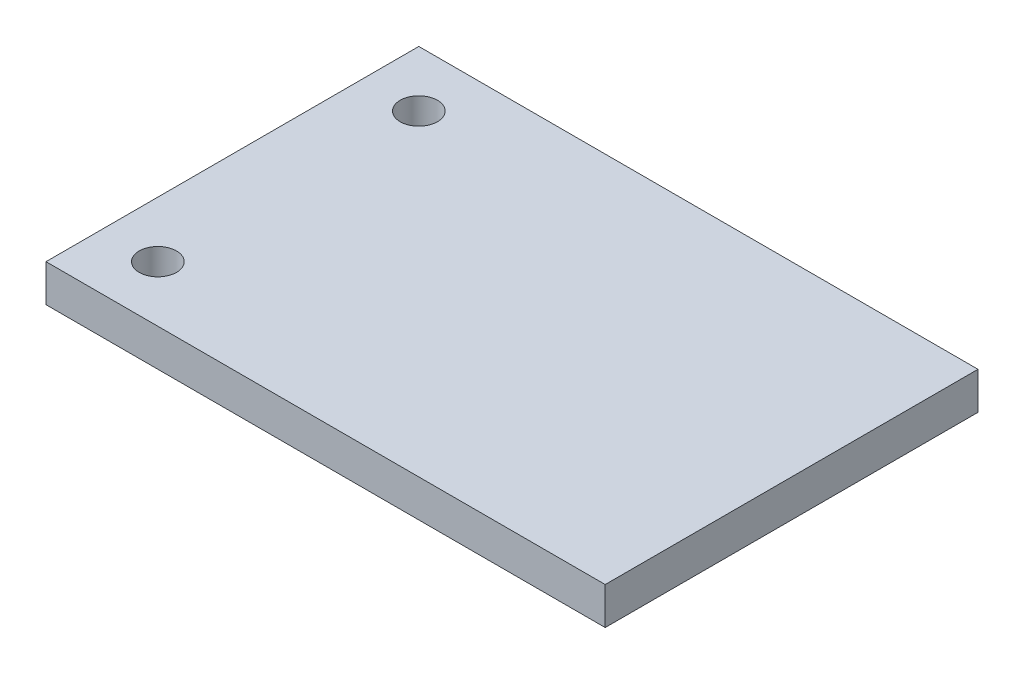
ISO-10303-21;
HEADER;
FILE_DESCRIPTION(('STEP AP214'),'2;1');
FILE_NAME('part.step','',(''),(''),'','','');
FILE_SCHEMA(('AUTOMOTIVE_DESIGN { 1 0 10303 214 1 1 1 1 }'));
ENDSEC;
DATA;
#1=APPLICATION_CONTEXT('core data for automotive mechanical design processes');
#2=APPLICATION_PROTOCOL_DEFINITION('international standard','automotive_design',2000,#1);
#3=PRODUCT_CONTEXT('',#1,'mechanical');
#4=PRODUCT('Part','Part','',(#3));
#5=PRODUCT_RELATED_PRODUCT_CATEGORY('part','',(#4));
#6=PRODUCT_DEFINITION_FORMATION('','',#4);
#7=PRODUCT_DEFINITION_CONTEXT('part definition',#1,'design');
#8=PRODUCT_DEFINITION('design','',#6,#7);
#9=PRODUCT_DEFINITION_SHAPE('','',#8);
#10=(LENGTH_UNIT() NAMED_UNIT(*) SI_UNIT(.MILLI.,.METRE.));
#11=(NAMED_UNIT(*) PLANE_ANGLE_UNIT() SI_UNIT($,.RADIAN.));
#12=(NAMED_UNIT(*) SI_UNIT($,.STERADIAN.) SOLID_ANGLE_UNIT());
#13=UNCERTAINTY_MEASURE_WITH_UNIT(LENGTH_MEASURE(1.E-05),#10,'distance_accuracy_value','');
#14=(GEOMETRIC_REPRESENTATION_CONTEXT(3) GLOBAL_UNCERTAINTY_ASSIGNED_CONTEXT((#13)) GLOBAL_UNIT_ASSIGNED_CONTEXT((#10,
#11,#12)) REPRESENTATION_CONTEXT('',''));
#15=CARTESIAN_POINT('',(0.,0.,0.));
#16=DIRECTION('',(0.,0.,1.));
#17=DIRECTION('',(1.,0.,0.));
#18=AXIS2_PLACEMENT_3D('',#15,#16,#17);
#19=CARTESIAN_POINT('',(0.,20.,0.));
#20=DIRECTION('',(0.,-1.,0.));
#21=DIRECTION('',(0.,0.,-1.));
#22=AXIS2_PLACEMENT_3D('',#19,#20,#21);
#23=PLANE('',#22);
#24=DIRECTION('',(0.,0.,1.));
#25=VECTOR('',#24,1.);
#26=CARTESIAN_POINT('',(0.,20.,0.));
#27=LINE('',#26,#25);
#28=CARTESIAN_POINT('',(0.,20.,-200.));
#29=VERTEX_POINT('',#28);
#30=CARTESIAN_POINT('',(0.,20.,0.));
#31=VERTEX_POINT('',#30);
#32=EDGE_CURVE('E103',#29,#31,#27,.T.);
#33=ORIENTED_EDGE('',*,*,#32,.T.);
#34=DIRECTION('',(1.,0.,0.));
#35=VECTOR('',#34,1.);
#36=CARTESIAN_POINT('',(0.,20.,0.));
#37=LINE('',#36,#35);
#38=CARTESIAN_POINT('',(300.,20.,0.));
#39=VERTEX_POINT('',#38);
#40=EDGE_CURVE('E98',#31,#39,#37,.T.);
#41=ORIENTED_EDGE('',*,*,#40,.T.);
#42=DIRECTION('',(0.,0.,-1.));
#43=VECTOR('',#42,1.);
#44=CARTESIAN_POINT('',(300.,20.,0.));
#45=LINE('',#44,#43);
#46=CARTESIAN_POINT('',(300.,20.,-200.));
#47=VERTEX_POINT('',#46);
#48=EDGE_CURVE('E101',#39,#47,#45,.T.);
#49=ORIENTED_EDGE('',*,*,#48,.T.);
#50=DIRECTION('',(-1.,0.,0.));
#51=VECTOR('',#50,1.);
#52=CARTESIAN_POINT('',(0.,20.,-200.));
#53=LINE('',#52,#51);
#54=EDGE_CURVE('E66',#47,#29,#53,.T.);
#55=ORIENTED_EDGE('',*,*,#54,.T.);
#56=EDGE_LOOP('',(#33,#41,#49,#55));
#57=FACE_BOUND('',#56,.T.);
#58=CARTESIAN_POINT('',(30.,20.,-30.));
#59=DIRECTION('',(0.,1.,0.));
#60=DIRECTION('',(0.,0.,1.));
#61=AXIS2_PLACEMENT_3D('',#58,#59,#60);
#62=CIRCLE('',#61,10.);
#63=CARTESIAN_POINT('',(30.,20.,-20.));
#64=VERTEX_POINT('',#63);
#65=EDGE_CURVE('E118',#64,#64,#62,.T.);
#66=ORIENTED_EDGE('',*,*,#65,.F.);
#67=EDGE_LOOP('',(#66));
#68=FACE_BOUND('',#67,.T.);
#69=CARTESIAN_POINT('',(30.,20.,-170.));
#70=DIRECTION('',(0.,1.,0.));
#71=DIRECTION('',(0.,0.,1.));
#72=AXIS2_PLACEMENT_3D('',#69,#70,#71);
#73=CIRCLE('',#72,10.);
#74=CARTESIAN_POINT('',(30.,20.,-160.));
#75=VERTEX_POINT('',#74);
#76=EDGE_CURVE('E135',#75,#75,#73,.T.);
#77=ORIENTED_EDGE('',*,*,#76,.F.);
#78=EDGE_LOOP('',(#77));
#79=FACE_BOUND('',#78,.T.);
#80=ADVANCED_FACE('F49',(#57,#68,#79),#23,.F.);
#81=CARTESIAN_POINT('',(0.,0.,0.));
#82=DIRECTION('',(0.,-1.,0.));
#83=DIRECTION('',(0.,0.,-1.));
#84=AXIS2_PLACEMENT_3D('',#81,#82,#83);
#85=PLANE('',#84);
#86=CARTESIAN_POINT('',(30.,0.,-30.));
#87=DIRECTION('',(0.,1.,0.));
#88=DIRECTION('',(0.,0.,1.));
#89=AXIS2_PLACEMENT_3D('',#86,#87,#88);
#90=CIRCLE('',#89,10.);
#91=CARTESIAN_POINT('',(30.,0.,-20.));
#92=VERTEX_POINT('',#91);
#93=EDGE_CURVE('E132',#92,#92,#90,.T.);
#94=ORIENTED_EDGE('',*,*,#93,.T.);
#95=EDGE_LOOP('',(#94));
#96=FACE_BOUND('',#95,.T.);
#97=DIRECTION('',(0.,0.,1.));
#98=VECTOR('',#97,1.);
#99=CARTESIAN_POINT('',(0.,0.,0.));
#100=LINE('',#99,#98);
#101=CARTESIAN_POINT('',(0.,0.,-200.));
#102=VERTEX_POINT('',#101);
#103=CARTESIAN_POINT('',(0.,0.,0.));
#104=VERTEX_POINT('',#103);
#105=EDGE_CURVE('E115',#102,#104,#100,.T.);
#106=ORIENTED_EDGE('',*,*,#105,.F.);
#107=DIRECTION('',(-1.,0.,0.));
#108=VECTOR('',#107,1.);
#109=CARTESIAN_POINT('',(0.,0.,-200.));
#110=LINE('',#109,#108);
#111=CARTESIAN_POINT('',(300.,0.,-200.));
#112=VERTEX_POINT('',#111);
#113=EDGE_CURVE('E91',#112,#102,#110,.T.);
#114=ORIENTED_EDGE('',*,*,#113,.F.);
#115=DIRECTION('',(0.,0.,-1.));
#116=VECTOR('',#115,1.);
#117=CARTESIAN_POINT('',(300.,0.,0.));
#118=LINE('',#117,#116);
#119=CARTESIAN_POINT('',(300.,0.,0.));
#120=VERTEX_POINT('',#119);
#121=EDGE_CURVE('E85',#120,#112,#118,.T.);
#122=ORIENTED_EDGE('',*,*,#121,.F.);
#123=DIRECTION('',(1.,0.,0.));
#124=VECTOR('',#123,1.);
#125=CARTESIAN_POINT('',(0.,0.,0.));
#126=LINE('',#125,#124);
#127=EDGE_CURVE('E107',#104,#120,#126,.T.);
#128=ORIENTED_EDGE('',*,*,#127,.F.);
#129=EDGE_LOOP('',(#106,#114,#122,#128));
#130=FACE_BOUND('',#129,.T.);
#131=CARTESIAN_POINT('',(30.,0.,-170.));
#132=DIRECTION('',(0.,1.,0.));
#133=DIRECTION('',(0.,0.,1.));
#134=AXIS2_PLACEMENT_3D('',#131,#132,#133);
#135=CIRCLE('',#134,10.);
#136=CARTESIAN_POINT('',(30.,0.,-160.));
#137=VERTEX_POINT('',#136);
#138=EDGE_CURVE('E138',#137,#137,#135,.T.);
#139=ORIENTED_EDGE('',*,*,#138,.T.);
#140=EDGE_LOOP('',(#139));
#141=FACE_BOUND('',#140,.T.);
#142=ADVANCED_FACE('F128',(#96,#130,#141),#85,.T.);
#143=CARTESIAN_POINT('',(0.,20.,0.));
#144=DIRECTION('',(1.,0.,0.));
#145=DIRECTION('',(0.,0.,-1.));
#146=AXIS2_PLACEMENT_3D('',#143,#144,#145);
#147=PLANE('',#146);
#148=ORIENTED_EDGE('',*,*,#105,.T.);
#149=DIRECTION('',(0.,-1.,0.));
#150=VECTOR('',#149,1.);
#151=CARTESIAN_POINT('',(0.,20.,0.));
#152=LINE('',#151,#150);
#153=EDGE_CURVE('E12',#31,#104,#152,.T.);
#154=ORIENTED_EDGE('',*,*,#153,.F.);
#155=ORIENTED_EDGE('',*,*,#32,.F.);
#156=DIRECTION('',(0.,-1.,0.));
#157=VECTOR('',#156,1.);
#158=CARTESIAN_POINT('',(0.,20.,-200.));
#159=LINE('',#158,#157);
#160=EDGE_CURVE('E111',#29,#102,#159,.T.);
#161=ORIENTED_EDGE('',*,*,#160,.T.);
#162=EDGE_LOOP('',(#148,#154,#155,#161));
#163=FACE_BOUND('',#162,.T.);
#164=ADVANCED_FACE('F51',(#163),#147,.F.);
#165=CARTESIAN_POINT('',(0.,20.,0.));
#166=DIRECTION('',(0.,0.,-1.));
#167=DIRECTION('',(-1.,0.,0.));
#168=AXIS2_PLACEMENT_3D('',#165,#166,#167);
#169=PLANE('',#168);
#170=ORIENTED_EDGE('',*,*,#127,.T.);
#171=DIRECTION('',(0.,-1.,0.));
#172=VECTOR('',#171,1.);
#173=CARTESIAN_POINT('',(300.,20.,0.));
#174=LINE('',#173,#172);
#175=EDGE_CURVE('E58',#39,#120,#174,.T.);
#176=ORIENTED_EDGE('',*,*,#175,.F.);
#177=ORIENTED_EDGE('',*,*,#40,.F.);
#178=ORIENTED_EDGE('',*,*,#153,.T.);
#179=EDGE_LOOP('',(#170,#176,#177,#178));
#180=FACE_BOUND('',#179,.T.);
#181=ADVANCED_FACE('F106',(#180),#169,.F.);
#182=CARTESIAN_POINT('',(300.,20.,0.));
#183=DIRECTION('',(-1.,0.,0.));
#184=DIRECTION('',(0.,0.,1.));
#185=AXIS2_PLACEMENT_3D('',#182,#183,#184);
#186=PLANE('',#185);
#187=ORIENTED_EDGE('',*,*,#121,.T.);
#188=DIRECTION('',(0.,-1.,0.));
#189=VECTOR('',#188,1.);
#190=CARTESIAN_POINT('',(300.,20.,-200.));
#191=LINE('',#190,#189);
#192=EDGE_CURVE('E108',#47,#112,#191,.T.);
#193=ORIENTED_EDGE('',*,*,#192,.F.);
#194=ORIENTED_EDGE('',*,*,#48,.F.);
#195=ORIENTED_EDGE('',*,*,#175,.T.);
#196=EDGE_LOOP('',(#187,#193,#194,#195));
#197=FACE_BOUND('',#196,.T.);
#198=ADVANCED_FACE('F109',(#197),#186,.F.);
#199=CARTESIAN_POINT('',(0.,20.,-200.));
#200=DIRECTION('',(0.,0.,1.));
#201=DIRECTION('',(1.,0.,0.));
#202=AXIS2_PLACEMENT_3D('',#199,#200,#201);
#203=PLANE('',#202);
#204=ORIENTED_EDGE('',*,*,#113,.T.);
#205=ORIENTED_EDGE('',*,*,#160,.F.);
#206=ORIENTED_EDGE('',*,*,#54,.F.);
#207=ORIENTED_EDGE('',*,*,#192,.T.);
#208=EDGE_LOOP('',(#204,#205,#206,#207));
#209=FACE_BOUND('',#208,.T.);
#210=ADVANCED_FACE('F125',(#209),#203,.F.);
#211=CARTESIAN_POINT('',(30.,20.,-30.));
#212=DIRECTION('',(0.,-1.,0.));
#213=DIRECTION('',(0.,0.,-1.));
#214=AXIS2_PLACEMENT_3D('',#211,#212,#213);
#215=CYLINDRICAL_SURFACE('',#214,10.);
#216=ORIENTED_EDGE('',*,*,#65,.T.);
#217=EDGE_LOOP('',(#216));
#218=FACE_BOUND('',#217,.T.);
#219=ORIENTED_EDGE('',*,*,#93,.F.);
#220=EDGE_LOOP('',(#219));
#221=FACE_BOUND('',#220,.T.);
#222=ADVANCED_FACE('F155',(#218,#221),#215,.F.);
#223=CARTESIAN_POINT('',(30.,20.,-170.));
#224=DIRECTION('',(0.,-1.,0.));
#225=DIRECTION('',(0.,0.,-1.));
#226=AXIS2_PLACEMENT_3D('',#223,#224,#225);
#227=CYLINDRICAL_SURFACE('',#226,10.);
#228=ORIENTED_EDGE('',*,*,#76,.T.);
#229=EDGE_LOOP('',(#228));
#230=FACE_BOUND('',#229,.T.);
#231=ORIENTED_EDGE('',*,*,#138,.F.);
#232=EDGE_LOOP('',(#231));
#233=FACE_BOUND('',#232,.T.);
#234=ADVANCED_FACE('F144',(#230,#233),#227,.F.);
#235=CLOSED_SHELL('',(#80,#142,#164,#181,#198,#210,#222,#234));
#236=MANIFOLD_SOLID_BREP('B2',#235);
#237=ADVANCED_BREP_SHAPE_REPRESENTATION('',(#18,#236),#14);
#238=SHAPE_DEFINITION_REPRESENTATION(#9,#237);
ENDSEC;
END-ISO-10303-21;
